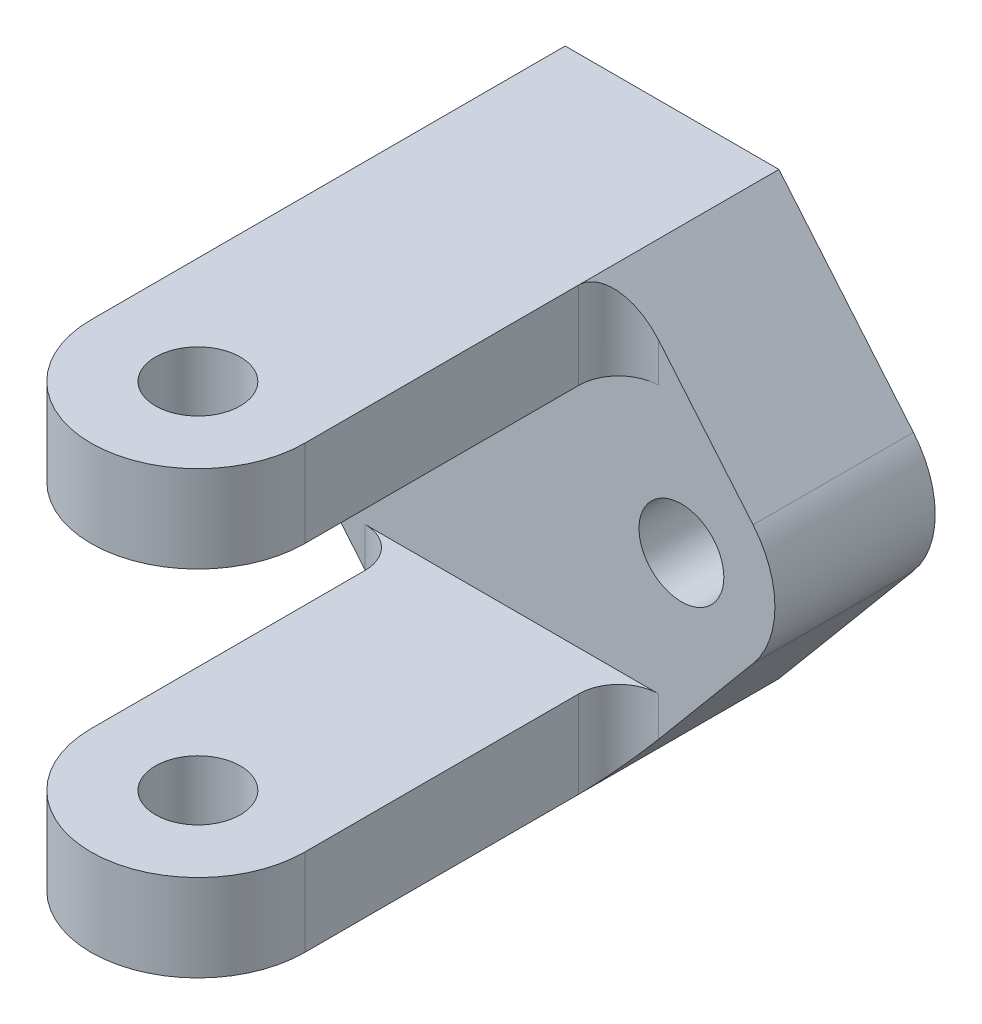
ISO-10303-21;
HEADER;
FILE_DESCRIPTION(('STEP AP214'),'2;1');
FILE_NAME('part.step','',(''),(''),'','','');
FILE_SCHEMA(('AUTOMOTIVE_DESIGN { 1 0 10303 214 1 1 1 1 }'));
ENDSEC;
DATA;
#1=APPLICATION_CONTEXT('core data for automotive mechanical design processes');
#2=APPLICATION_PROTOCOL_DEFINITION('international standard','automotive_design',2000,#1);
#3=PRODUCT_CONTEXT('',#1,'mechanical');
#4=PRODUCT('Part','Part','',(#3));
#5=PRODUCT_RELATED_PRODUCT_CATEGORY('part','',(#4));
#6=PRODUCT_DEFINITION_FORMATION('','',#4);
#7=PRODUCT_DEFINITION_CONTEXT('part definition',#1,'design');
#8=PRODUCT_DEFINITION('design','',#6,#7);
#9=PRODUCT_DEFINITION_SHAPE('','',#8);
#10=(LENGTH_UNIT() NAMED_UNIT(*) SI_UNIT(.MILLI.,.METRE.));
#11=(NAMED_UNIT(*) PLANE_ANGLE_UNIT() SI_UNIT($,.RADIAN.));
#12=(NAMED_UNIT(*) SI_UNIT($,.STERADIAN.) SOLID_ANGLE_UNIT());
#13=UNCERTAINTY_MEASURE_WITH_UNIT(LENGTH_MEASURE(1.E-05),#10,'distance_accuracy_value','');
#14=(GEOMETRIC_REPRESENTATION_CONTEXT(3) GLOBAL_UNCERTAINTY_ASSIGNED_CONTEXT((#13)) GLOBAL_UNIT_ASSIGNED_CONTEXT((#10,
#11,#12)) REPRESENTATION_CONTEXT('',''));
#15=CARTESIAN_POINT('',(0.,0.,0.));
#16=DIRECTION('',(0.,0.,1.));
#17=DIRECTION('',(1.,0.,0.));
#18=AXIS2_PLACEMENT_3D('',#15,#16,#17);
#19=CARTESIAN_POINT('',(-8.,-83.7629553253982,20.));
#20=DIRECTION('',(1.,0.,0.));
#21=DIRECTION('',(0.,0.,-1.));
#22=AXIS2_PLACEMENT_3D('',#19,#20,#21);
#23=PLANE('',#22);
#24=DIRECTION('',(0.,0.,1.));
#25=VECTOR('',#24,1.);
#26=CARTESIAN_POINT('',(-8.,16.51,20.));
#27=LINE('',#26,#25);
#28=CARTESIAN_POINT('',(-8.,16.51,15.));
#29=VERTEX_POINT('',#28);
#30=CARTESIAN_POINT('',(-8.,16.51,35.5));
#31=VERTEX_POINT('',#30);
#32=EDGE_CURVE('E194',#29,#31,#27,.T.);
#33=ORIENTED_EDGE('',*,*,#32,.F.);
#34=DIRECTION('',(0.,1.,0.));
#35=VECTOR('',#34,1.);
#36=CARTESIAN_POINT('',(-8.,9.99999999999999,15.));
#37=LINE('',#36,#35);
#38=CARTESIAN_POINT('',(-8.,10.,15.));
#39=VERTEX_POINT('',#38);
#40=EDGE_CURVE('E324',#29,#39,#37,.F.);
#41=ORIENTED_EDGE('',*,*,#40,.T.);
#42=DIRECTION('',(0.,0.,-1.));
#43=VECTOR('',#42,1.);
#44=CARTESIAN_POINT('',(-8.,10.,65.));
#45=LINE('',#44,#43);
#46=CARTESIAN_POINT('',(-8.,9.99999999999999,35.5));
#47=VERTEX_POINT('',#46);
#48=EDGE_CURVE('E250',#47,#39,#45,.T.);
#49=ORIENTED_EDGE('',*,*,#48,.F.);
#50=DIRECTION('',(0.,1.,0.));
#51=VECTOR('',#50,1.);
#52=CARTESIAN_POINT('',(-8.,-83.7629553253982,35.5));
#53=LINE('',#52,#51);
#54=EDGE_CURVE('E239',#47,#31,#53,.T.);
#55=ORIENTED_EDGE('',*,*,#54,.T.);
#56=EDGE_LOOP('',(#33,#41,#49,#55));
#57=FACE_BOUND('',#56,.T.);
#58=ADVANCED_FACE('F45',(#57),#23,.F.);
#59=CARTESIAN_POINT('',(8.,-83.7629553253982,35.5));
#60=DIRECTION('',(-1.,0.,0.));
#61=DIRECTION('',(0.,0.,1.));
#62=AXIS2_PLACEMENT_3D('',#59,#60,#61);
#63=PLANE('',#62);
#64=DIRECTION('',(0.,0.,1.));
#65=VECTOR('',#64,1.);
#66=CARTESIAN_POINT('',(8.,10.,65.));
#67=LINE('',#66,#65);
#68=CARTESIAN_POINT('',(8.,10.,15.));
#69=VERTEX_POINT('',#68);
#70=CARTESIAN_POINT('',(8.,9.99999999999999,35.5));
#71=VERTEX_POINT('',#70);
#72=EDGE_CURVE('E235',#69,#71,#67,.T.);
#73=ORIENTED_EDGE('',*,*,#72,.F.);
#74=DIRECTION('',(0.,1.,0.));
#75=VECTOR('',#74,1.);
#76=CARTESIAN_POINT('',(8.,16.51,15.));
#77=LINE('',#76,#75);
#78=CARTESIAN_POINT('',(8.,16.51,15.));
#79=VERTEX_POINT('',#78);
#80=EDGE_CURVE('E334',#69,#79,#77,.T.);
#81=ORIENTED_EDGE('',*,*,#80,.T.);
#82=DIRECTION('',(0.,0.,-1.));
#83=VECTOR('',#82,1.);
#84=CARTESIAN_POINT('',(8.,16.51,35.5));
#85=LINE('',#84,#83);
#86=CARTESIAN_POINT('',(8.,16.51,35.5));
#87=VERTEX_POINT('',#86);
#88=EDGE_CURVE('E219',#87,#79,#85,.T.);
#89=ORIENTED_EDGE('',*,*,#88,.F.);
#90=DIRECTION('',(0.,1.,0.));
#91=VECTOR('',#90,1.);
#92=CARTESIAN_POINT('',(8.,-83.7629553253982,35.5));
#93=LINE('',#92,#91);
#94=EDGE_CURVE('E223',#71,#87,#93,.T.);
#95=ORIENTED_EDGE('',*,*,#94,.F.);
#96=EDGE_LOOP('',(#73,#81,#89,#95));
#97=FACE_BOUND('',#96,.T.);
#98=ADVANCED_FACE('F384',(#97),#63,.F.);
#99=CARTESIAN_POINT('',(12.7,0.,47.3781062240477));
#100=DIRECTION('',(0.,0.,-1.));
#101=DIRECTION('',(-1.,0.,0.));
#102=AXIS2_PLACEMENT_3D('',#99,#100,#101);
#103=CYLINDRICAL_SURFACE('',#102,7.);
#104=CARTESIAN_POINT('',(12.7,0.,0.));
#105=DIRECTION('',(0.,0.,1.));
#106=DIRECTION('',(1.,0.,0.));
#107=AXIS2_PLACEMENT_3D('',#104,#105,#106);
#108=CIRCLE('',#107,7.);
#109=CARTESIAN_POINT('',(18.0657591468047,4.49540084736414,0.));
#110=VERTEX_POINT('',#109);
#111=CARTESIAN_POINT('',(18.0657591468047,-4.49540084736414,0.));
#112=VERTEX_POINT('',#111);
#113=EDGE_CURVE('E210',#110,#112,#108,.F.);
#114=ORIENTED_EDGE('',*,*,#113,.F.);
#115=DIRECTION('',(0.,0.,-1.));
#116=VECTOR('',#115,1.);
#117=CARTESIAN_POINT('',(18.0657591468047,4.49540084736414,27.6738667851937));
#118=LINE('',#117,#116);
#119=CARTESIAN_POINT('',(18.0657591468047,4.49540084736414,12.));
#120=VERTEX_POINT('',#119);
#121=EDGE_CURVE('E376',#120,#110,#118,.T.);
#122=ORIENTED_EDGE('',*,*,#121,.F.);
#123=CARTESIAN_POINT('',(12.7,0.,12.));
#124=DIRECTION('',(0.,0.,-1.));
#125=DIRECTION('',(-1.,0.,0.));
#126=AXIS2_PLACEMENT_3D('',#123,#124,#125);
#127=CIRCLE('',#126,7.);
#128=CARTESIAN_POINT('',(18.0657591468046,-4.49540084736413,12.));
#129=VERTEX_POINT('',#128);
#130=EDGE_CURVE('E201',#129,#120,#127,.F.);
#131=ORIENTED_EDGE('',*,*,#130,.F.);
#132=DIRECTION('',(0.,0.,-1.));
#133=VECTOR('',#132,1.);
#134=CARTESIAN_POINT('',(18.0657591468047,-4.49540084736414,27.6738667851937));
#135=LINE('',#134,#133);
#136=EDGE_CURVE('E204',#129,#112,#135,.T.);
#137=ORIENTED_EDGE('',*,*,#136,.T.);
#138=EDGE_LOOP('',(#114,#122,#131,#137));
#139=FACE_BOUND('',#138,.T.);
#140=ADVANCED_FACE('F446',(#139),#103,.T.);
#141=DIRECTION('',(0.,0.,1.));
#142=VECTOR('',#141,1.);
#143=CARTESIAN_POINT('',(-8.,-10.,65.));
#144=LINE('',#143,#142);
#145=CARTESIAN_POINT('',(-8.,-10.,15.));
#146=VERTEX_POINT('',#145);
#147=CARTESIAN_POINT('',(-8.,-9.99999999999999,35.5));
#148=VERTEX_POINT('',#147);
#149=EDGE_CURVE('E307',#146,#148,#144,.T.);
#150=ORIENTED_EDGE('',*,*,#149,.F.);
#151=DIRECTION('',(0.,-1.,0.));
#152=VECTOR('',#151,1.);
#153=CARTESIAN_POINT('',(-8.,-16.51,15.));
#154=LINE('',#153,#152);
#155=CARTESIAN_POINT('',(-8.,-16.51,15.));
#156=VERTEX_POINT('',#155);
#157=EDGE_CURVE('E327',#146,#156,#154,.T.);
#158=ORIENTED_EDGE('',*,*,#157,.T.);
#159=DIRECTION('',(0.,0.,1.));
#160=VECTOR('',#159,1.);
#161=CARTESIAN_POINT('',(-8.,-16.51,20.));
#162=LINE('',#161,#160);
#163=CARTESIAN_POINT('',(-8.,-16.51,35.5));
#164=VERTEX_POINT('',#163);
#165=EDGE_CURVE('E231',#156,#164,#162,.T.);
#166=ORIENTED_EDGE('',*,*,#165,.T.);
#167=EDGE_CURVE('E228',#164,#148,#53,.T.);
#168=ORIENTED_EDGE('',*,*,#167,.T.);
#169=EDGE_LOOP('',(#150,#158,#166,#168));
#170=FACE_BOUND('',#169,.T.);
#171=ADVANCED_FACE('F396',(#170),#23,.F.);
#172=CARTESIAN_POINT('',(-12.7,0.,47.3781062240477));
#173=DIRECTION('',(0.,0.,-1.));
#174=DIRECTION('',(-1.,0.,0.));
#175=AXIS2_PLACEMENT_3D('',#172,#173,#174);
#176=CYLINDRICAL_SURFACE('',#175,7.);
#177=CARTESIAN_POINT('',(-12.7,0.,12.));
#178=DIRECTION('',(0.,0.,-1.));
#179=DIRECTION('',(-1.,0.,0.));
#180=AXIS2_PLACEMENT_3D('',#177,#178,#179);
#181=CIRCLE('',#180,7.);
#182=CARTESIAN_POINT('',(-18.0657591468047,-4.49540084736414,12.));
#183=VERTEX_POINT('',#182);
#184=CARTESIAN_POINT('',(-18.0657591468047,4.49540084736414,12.));
#185=VERTEX_POINT('',#184);
#186=EDGE_CURVE('E173',#183,#185,#181,.T.);
#187=ORIENTED_EDGE('',*,*,#186,.T.);
#188=DIRECTION('',(0.,0.,-1.));
#189=VECTOR('',#188,1.);
#190=CARTESIAN_POINT('',(-18.0657591468047,4.49540084736414,27.6738667851937));
#191=LINE('',#190,#189);
#192=CARTESIAN_POINT('',(-18.0657591468047,4.49540084736414,0.));
#193=VERTEX_POINT('',#192);
#194=EDGE_CURVE('E180',#185,#193,#191,.T.);
#195=ORIENTED_EDGE('',*,*,#194,.T.);
#196=CARTESIAN_POINT('',(-12.7,0.,0.));
#197=DIRECTION('',(0.,0.,1.));
#198=DIRECTION('',(1.,0.,0.));
#199=AXIS2_PLACEMENT_3D('',#196,#197,#198);
#200=CIRCLE('',#199,7.);
#201=CARTESIAN_POINT('',(-18.0657591468046,-4.49540084736414,0.));
#202=VERTEX_POINT('',#201);
#203=EDGE_CURVE('E195',#193,#202,#200,.T.);
#204=ORIENTED_EDGE('',*,*,#203,.T.);
#205=DIRECTION('',(0.,0.,-1.));
#206=VECTOR('',#205,1.);
#207=CARTESIAN_POINT('',(-18.0657591468046,-4.49540084736414,27.6738667851937));
#208=LINE('',#207,#206);
#209=EDGE_CURVE('E192',#183,#202,#208,.T.);
#210=ORIENTED_EDGE('',*,*,#209,.F.);
#211=EDGE_LOOP('',(#187,#195,#204,#210));
#212=FACE_BOUND('',#211,.T.);
#213=ADVANCED_FACE('F190',(#212),#176,.T.);
#214=DIRECTION('',(0.,0.,-1.));
#215=VECTOR('',#214,1.);
#216=CARTESIAN_POINT('',(8.,-16.51,35.5));
#217=LINE('',#216,#215);
#218=CARTESIAN_POINT('',(8.,-16.51,35.5));
#219=VERTEX_POINT('',#218);
#220=CARTESIAN_POINT('',(8.,-16.51,15.));
#221=VERTEX_POINT('',#220);
#222=EDGE_CURVE('E224',#219,#221,#217,.T.);
#223=ORIENTED_EDGE('',*,*,#222,.T.);
#224=DIRECTION('',(0.,-1.,0.));
#225=VECTOR('',#224,1.);
#226=CARTESIAN_POINT('',(8.,-9.99999999999999,15.));
#227=LINE('',#226,#225);
#228=CARTESIAN_POINT('',(8.,-9.99999999999999,15.));
#229=VERTEX_POINT('',#228);
#230=EDGE_CURVE('E331',#221,#229,#227,.F.);
#231=ORIENTED_EDGE('',*,*,#230,.T.);
#232=DIRECTION('',(0.,0.,-1.));
#233=VECTOR('',#232,1.);
#234=CARTESIAN_POINT('',(8.,-9.99999999999999,65.));
#235=LINE('',#234,#233);
#236=CARTESIAN_POINT('',(8.,-9.99999999999999,35.5));
#237=VERTEX_POINT('',#236);
#238=EDGE_CURVE('E296',#237,#229,#235,.T.);
#239=ORIENTED_EDGE('',*,*,#238,.F.);
#240=EDGE_CURVE('E240',#219,#237,#93,.T.);
#241=ORIENTED_EDGE('',*,*,#240,.F.);
#242=EDGE_LOOP('',(#223,#231,#239,#241));
#243=FACE_BOUND('',#242,.T.);
#244=ADVANCED_FACE('F405',(#243),#63,.F.);
#245=CARTESIAN_POINT('',(0.,0.,12.));
#246=DIRECTION('',(0.,0.,-1.));
#247=DIRECTION('',(-1.,0.,0.));
#248=AXIS2_PLACEMENT_3D('',#245,#246,#247);
#249=PLANE('',#248);
#250=DIRECTION('',(1.,0.,0.));
#251=VECTOR('',#250,1.);
#252=CARTESIAN_POINT('',(-20.7,10.,12.));
#253=LINE('',#252,#251);
#254=CARTESIAN_POINT('',(-11.,10.,12.));
#255=VERTEX_POINT('',#254);
#256=CARTESIAN_POINT('',(11.,10.,12.));
#257=VERTEX_POINT('',#256);
#258=EDGE_CURVE('E270',#255,#257,#253,.T.);
#259=ORIENTED_EDGE('',*,*,#258,.F.);
#260=DIRECTION('',(0.,1.,0.));
#261=VECTOR('',#260,1.);
#262=CARTESIAN_POINT('',(-11.,16.51,12.));
#263=LINE('',#262,#261);
#264=CARTESIAN_POINT('',(-11.,12.9291675031933,12.));
#265=VERTEX_POINT('',#264);
#266=EDGE_CURVE('E176',#255,#265,#263,.T.);
#267=ORIENTED_EDGE('',*,*,#266,.T.);
#268=DIRECTION('',(0.64220012105202,0.766537020972093,0.));
#269=VECTOR('',#268,1.);
#270=CARTESIAN_POINT('',(-8.,16.51,12.));
#271=LINE('',#270,#269);
#272=EDGE_CURVE('E167',#185,#265,#271,.T.);
#273=ORIENTED_EDGE('',*,*,#272,.F.);
#274=ORIENTED_EDGE('',*,*,#186,.F.);
#275=DIRECTION('',(0.64220012105202,-0.766537020972093,0.));
#276=VECTOR('',#275,1.);
#277=CARTESIAN_POINT('',(-12.8280125042184,-10.7472319766351,12.));
#278=LINE('',#277,#276);
#279=CARTESIAN_POINT('',(-11.,-12.9291675031933,12.));
#280=VERTEX_POINT('',#279);
#281=EDGE_CURVE('E425',#183,#280,#278,.T.);
#282=ORIENTED_EDGE('',*,*,#281,.T.);
#283=DIRECTION('',(0.,-1.,0.));
#284=VECTOR('',#283,1.);
#285=CARTESIAN_POINT('',(-11.,-9.99999999999999,12.));
#286=LINE('',#285,#284);
#287=CARTESIAN_POINT('',(-11.,-10.,12.));
#288=VERTEX_POINT('',#287);
#289=EDGE_CURVE('E318',#280,#288,#286,.F.);
#290=ORIENTED_EDGE('',*,*,#289,.T.);
#291=DIRECTION('',(-1.,0.,0.));
#292=VECTOR('',#291,1.);
#293=CARTESIAN_POINT('',(-20.7,-10.,12.));
#294=LINE('',#293,#292);
#295=CARTESIAN_POINT('',(11.,-9.99999999999999,12.));
#296=VERTEX_POINT('',#295);
#297=EDGE_CURVE('E267',#296,#288,#294,.T.);
#298=ORIENTED_EDGE('',*,*,#297,.F.);
#299=DIRECTION('',(0.,-1.,0.));
#300=VECTOR('',#299,1.);
#301=CARTESIAN_POINT('',(11.,-16.51,12.));
#302=LINE('',#301,#300);
#303=CARTESIAN_POINT('',(11.,-12.9291675031933,12.));
#304=VERTEX_POINT('',#303);
#305=EDGE_CURVE('E314',#296,#304,#302,.T.);
#306=ORIENTED_EDGE('',*,*,#305,.T.);
#307=DIRECTION('',(-0.64220012105202,-0.766537020972093,0.));
#308=VECTOR('',#307,1.);
#309=CARTESIAN_POINT('',(12.8280125042185,-10.7472319766351,12.));
#310=LINE('',#309,#308);
#311=EDGE_CURVE('E212',#129,#304,#310,.T.);
#312=ORIENTED_EDGE('',*,*,#311,.F.);
#313=ORIENTED_EDGE('',*,*,#130,.T.);
#314=DIRECTION('',(-0.64220012105202,0.766537020972093,0.));
#315=VECTOR('',#314,1.);
#316=CARTESIAN_POINT('',(8.,16.51,12.));
#317=LINE('',#316,#315);
#318=CARTESIAN_POINT('',(11.,12.9291675031933,12.));
#319=VERTEX_POINT('',#318);
#320=EDGE_CURVE('E366',#120,#319,#317,.T.);
#321=ORIENTED_EDGE('',*,*,#320,.T.);
#322=DIRECTION('',(0.,1.,0.));
#323=VECTOR('',#322,1.);
#324=CARTESIAN_POINT('',(11.,9.99999999999999,12.));
#325=LINE('',#324,#323);
#326=EDGE_CURVE('E310',#319,#257,#325,.F.);
#327=ORIENTED_EDGE('',*,*,#326,.T.);
#328=EDGE_LOOP('',(#259,#267,#273,#274,#282,#290,#298,#306,#312,#313,#321,#327));
#329=FACE_BOUND('',#328,.T.);
#330=CARTESIAN_POINT('',(-12.7,0.,12.));
#331=DIRECTION('',(0.,0.,1.));
#332=DIRECTION('',(1.,0.,0.));
#333=AXIS2_PLACEMENT_3D('',#330,#331,#332);
#334=CIRCLE('',#333,3.175);
#335=CARTESIAN_POINT('',(-9.525,0.,12.));
#336=VERTEX_POINT('',#335);
#337=EDGE_CURVE('E274',#336,#336,#334,.T.);
#338=ORIENTED_EDGE('',*,*,#337,.F.);
#339=EDGE_LOOP('',(#338));
#340=FACE_BOUND('',#339,.T.);
#341=CARTESIAN_POINT('',(12.7,0.,12.));
#342=DIRECTION('',(0.,0.,1.));
#343=DIRECTION('',(1.,0.,0.));
#344=AXIS2_PLACEMENT_3D('',#341,#342,#343);
#345=CIRCLE('',#344,3.175);
#346=CARTESIAN_POINT('',(15.875,0.,12.));
#347=VERTEX_POINT('',#346);
#348=EDGE_CURVE('E282',#347,#347,#345,.T.);
#349=ORIENTED_EDGE('',*,*,#348,.F.);
#350=EDGE_LOOP('',(#349));
#351=FACE_BOUND('',#350,.T.);
#352=ADVANCED_FACE('F169',(#329,#340,#351),#249,.F.);
#353=CARTESIAN_POINT('',(0.,0.,0.));
#354=DIRECTION('',(0.,0.,-1.));
#355=DIRECTION('',(-1.,0.,0.));
#356=AXIS2_PLACEMENT_3D('',#353,#354,#355);
#357=PLANE('',#356);
#358=ORIENTED_EDGE('',*,*,#203,.F.);
#359=DIRECTION('',(-0.64220012105202,-0.766537020972093,0.));
#360=VECTOR('',#359,1.);
#361=CARTESIAN_POINT('',(-8.,16.51,0.));
#362=LINE('',#361,#360);
#363=CARTESIAN_POINT('',(-8.,16.51,0.));
#364=VERTEX_POINT('',#363);
#365=EDGE_CURVE('E185',#364,#193,#362,.T.);
#366=ORIENTED_EDGE('',*,*,#365,.F.);
#367=DIRECTION('',(-1.,0.,0.));
#368=VECTOR('',#367,1.);
#369=CARTESIAN_POINT('',(-20.7,16.51,0.));
#370=LINE('',#369,#368);
#371=CARTESIAN_POINT('',(8.,16.51,0.));
#372=VERTEX_POINT('',#371);
#373=EDGE_CURVE('E286',#372,#364,#370,.T.);
#374=ORIENTED_EDGE('',*,*,#373,.F.);
#375=DIRECTION('',(0.64220012105202,-0.766537020972093,0.));
#376=VECTOR('',#375,1.);
#377=CARTESIAN_POINT('',(8.,16.51,0.));
#378=LINE('',#377,#376);
#379=EDGE_CURVE('E428',#372,#110,#378,.T.);
#380=ORIENTED_EDGE('',*,*,#379,.T.);
#381=ORIENTED_EDGE('',*,*,#113,.T.);
#382=DIRECTION('',(0.64220012105202,0.766537020972093,0.));
#383=VECTOR('',#382,1.);
#384=CARTESIAN_POINT('',(12.8280125042185,-10.7472319766351,0.));
#385=LINE('',#384,#383);
#386=CARTESIAN_POINT('',(8.,-16.51,0.));
#387=VERTEX_POINT('',#386);
#388=EDGE_CURVE('E440',#387,#112,#385,.T.);
#389=ORIENTED_EDGE('',*,*,#388,.F.);
#390=DIRECTION('',(1.,0.,0.));
#391=VECTOR('',#390,1.);
#392=CARTESIAN_POINT('',(-20.7,-16.51,0.));
#393=LINE('',#392,#391);
#394=CARTESIAN_POINT('',(-8.,-16.51,0.));
#395=VERTEX_POINT('',#394);
#396=EDGE_CURVE('E293',#395,#387,#393,.T.);
#397=ORIENTED_EDGE('',*,*,#396,.F.);
#398=DIRECTION('',(-0.64220012105202,0.766537020972093,0.));
#399=VECTOR('',#398,1.);
#400=CARTESIAN_POINT('',(-12.8280125042184,-10.7472319766351,0.));
#401=LINE('',#400,#399);
#402=EDGE_CURVE('E432',#395,#202,#401,.T.);
#403=ORIENTED_EDGE('',*,*,#402,.T.);
#404=EDGE_LOOP('',(#358,#366,#374,#380,#381,#389,#397,#403));
#405=FACE_BOUND('',#404,.T.);
#406=CARTESIAN_POINT('',(12.7,0.,0.));
#407=DIRECTION('',(0.,0.,1.));
#408=DIRECTION('',(1.,0.,0.));
#409=AXIS2_PLACEMENT_3D('',#406,#407,#408);
#410=CIRCLE('',#409,3.175);
#411=CARTESIAN_POINT('',(15.875,0.,0.));
#412=VERTEX_POINT('',#411);
#413=EDGE_CURVE('E278',#412,#412,#410,.T.);
#414=ORIENTED_EDGE('',*,*,#413,.T.);
#415=EDGE_LOOP('',(#414));
#416=FACE_BOUND('',#415,.T.);
#417=CARTESIAN_POINT('',(-12.7,0.,0.));
#418=DIRECTION('',(0.,0.,1.));
#419=DIRECTION('',(1.,0.,0.));
#420=AXIS2_PLACEMENT_3D('',#417,#418,#419);
#421=CIRCLE('',#420,3.175);
#422=CARTESIAN_POINT('',(-9.525,0.,0.));
#423=VERTEX_POINT('',#422);
#424=EDGE_CURVE('E273',#423,#423,#421,.T.);
#425=ORIENTED_EDGE('',*,*,#424,.T.);
#426=EDGE_LOOP('',(#425));
#427=FACE_BOUND('',#426,.T.);
#428=ADVANCED_FACE('F449',(#405,#416,#427),#357,.T.);
#429=CARTESIAN_POINT('',(-20.7,16.51,12.));
#430=DIRECTION('',(0.,-1.,0.));
#431=DIRECTION('',(0.,0.,-1.));
#432=AXIS2_PLACEMENT_3D('',#429,#430,#431);
#433=PLANE('',#432);
#434=CARTESIAN_POINT('',(0.,16.51,35.5));
#435=DIRECTION('',(0.,-1.,0.));
#436=DIRECTION('',(0.,0.,-1.));
#437=AXIS2_PLACEMENT_3D('',#434,#435,#436);
#438=CIRCLE('',#437,3.175);
#439=CARTESIAN_POINT('',(0.,16.51,38.675));
#440=VERTEX_POINT('',#439);
#441=EDGE_CURVE('E254',#440,#440,#438,.T.);
#442=ORIENTED_EDGE('',*,*,#441,.T.);
#443=EDGE_LOOP('',(#442));
#444=FACE_BOUND('',#443,.T.);
#445=ORIENTED_EDGE('',*,*,#373,.T.);
#446=EDGE_CURVE('E199',#364,#29,#27,.T.);
#447=ORIENTED_EDGE('',*,*,#446,.T.);
#448=ORIENTED_EDGE('',*,*,#32,.T.);
#449=CARTESIAN_POINT('',(0.,16.51,35.5));
#450=DIRECTION('',(0.,-1.,0.));
#451=DIRECTION('',(0.,0.,-1.));
#452=AXIS2_PLACEMENT_3D('',#449,#450,#451);
#453=CIRCLE('',#452,8.);
#454=EDGE_CURVE('E215',#31,#87,#453,.F.);
#455=ORIENTED_EDGE('',*,*,#454,.T.);
#456=ORIENTED_EDGE('',*,*,#88,.T.);
#457=DIRECTION('',(0.,0.,-1.));
#458=VECTOR('',#457,1.);
#459=CARTESIAN_POINT('',(8.,16.51,27.6738667851937));
#460=LINE('',#459,#458);
#461=EDGE_CURVE('E368',#79,#372,#460,.T.);
#462=ORIENTED_EDGE('',*,*,#461,.T.);
#463=EDGE_LOOP('',(#445,#447,#448,#455,#456,#462));
#464=FACE_BOUND('',#463,.T.);
#465=ADVANCED_FACE('F460',(#444,#464),#433,.F.);
#466=CARTESIAN_POINT('',(-20.7,-16.51,12.));
#467=DIRECTION('',(0.,1.,0.));
#468=DIRECTION('',(0.,0.,1.));
#469=AXIS2_PLACEMENT_3D('',#466,#467,#468);
#470=PLANE('',#469);
#471=CARTESIAN_POINT('',(0.,-16.51,35.5));
#472=DIRECTION('',(0.,1.,0.));
#473=DIRECTION('',(0.,0.,1.));
#474=AXIS2_PLACEMENT_3D('',#471,#472,#473);
#475=CIRCLE('',#474,3.175);
#476=CARTESIAN_POINT('',(0.,-16.51,38.675));
#477=VERTEX_POINT('',#476);
#478=EDGE_CURVE('E258',#477,#477,#475,.F.);
#479=ORIENTED_EDGE('',*,*,#478,.F.);
#480=EDGE_LOOP('',(#479));
#481=FACE_BOUND('',#480,.T.);
#482=EDGE_CURVE('E232',#395,#156,#162,.T.);
#483=ORIENTED_EDGE('',*,*,#482,.F.);
#484=ORIENTED_EDGE('',*,*,#396,.T.);
#485=DIRECTION('',(0.,0.,-1.));
#486=VECTOR('',#485,1.);
#487=CARTESIAN_POINT('',(8.,-16.51,27.6738667851937));
#488=LINE('',#487,#486);
#489=EDGE_CURVE('E62',#221,#387,#488,.T.);
#490=ORIENTED_EDGE('',*,*,#489,.F.);
#491=ORIENTED_EDGE('',*,*,#222,.F.);
#492=CARTESIAN_POINT('',(0.,-16.51,35.5));
#493=DIRECTION('',(0.,1.,0.));
#494=DIRECTION('',(0.,0.,1.));
#495=AXIS2_PLACEMENT_3D('',#492,#493,#494);
#496=CIRCLE('',#495,8.);
#497=EDGE_CURVE('E227',#164,#219,#496,.T.);
#498=ORIENTED_EDGE('',*,*,#497,.F.);
#499=ORIENTED_EDGE('',*,*,#165,.F.);
#500=EDGE_LOOP('',(#483,#484,#490,#491,#498,#499));
#501=FACE_BOUND('',#500,.T.);
#502=ADVANCED_FACE('F403',(#481,#501),#470,.F.);
#503=CARTESIAN_POINT('',(12.7,0.,12.));
#504=DIRECTION('',(0.,0.,-1.));
#505=DIRECTION('',(-1.,0.,0.));
#506=AXIS2_PLACEMENT_3D('',#503,#504,#505);
#507=CYLINDRICAL_SURFACE('',#506,3.175);
#508=ORIENTED_EDGE('',*,*,#348,.T.);
#509=EDGE_LOOP('',(#508));
#510=FACE_BOUND('',#509,.T.);
#511=ORIENTED_EDGE('',*,*,#413,.F.);
#512=EDGE_LOOP('',(#511));
#513=FACE_BOUND('',#512,.T.);
#514=ADVANCED_FACE('F594',(#510,#513),#507,.F.);
#515=CARTESIAN_POINT('',(-12.7,0.,12.));
#516=DIRECTION('',(0.,0.,-1.));
#517=DIRECTION('',(-1.,0.,0.));
#518=AXIS2_PLACEMENT_3D('',#515,#516,#517);
#519=CYLINDRICAL_SURFACE('',#518,3.175);
#520=ORIENTED_EDGE('',*,*,#337,.T.);
#521=EDGE_LOOP('',(#520));
#522=FACE_BOUND('',#521,.T.);
#523=ORIENTED_EDGE('',*,*,#424,.F.);
#524=EDGE_LOOP('',(#523));
#525=FACE_BOUND('',#524,.T.);
#526=ADVANCED_FACE('F585',(#522,#525),#519,.F.);
#527=CARTESIAN_POINT('',(-20.7,10.,65.));
#528=DIRECTION('',(0.,1.,0.));
#529=DIRECTION('',(0.,0.,1.));
#530=AXIS2_PLACEMENT_3D('',#527,#528,#529);
#531=PLANE('',#530);
#532=CARTESIAN_POINT('',(0.,10.,35.5));
#533=DIRECTION('',(0.,1.,0.));
#534=DIRECTION('',(0.,0.,1.));
#535=AXIS2_PLACEMENT_3D('',#532,#533,#534);
#536=CIRCLE('',#535,3.175);
#537=CARTESIAN_POINT('',(0.,10.,38.675));
#538=VERTEX_POINT('',#537);
#539=EDGE_CURVE('E263',#538,#538,#536,.T.);
#540=ORIENTED_EDGE('',*,*,#539,.T.);
#541=EDGE_LOOP('',(#540));
#542=FACE_BOUND('',#541,.T.);
#543=CARTESIAN_POINT('',(0.,9.99999999999999,35.5));
#544=DIRECTION('',(0.,1.,0.));
#545=DIRECTION('',(0.,0.,1.));
#546=AXIS2_PLACEMENT_3D('',#543,#544,#545);
#547=CIRCLE('',#546,8.);
#548=EDGE_CURVE('E246',#71,#47,#547,.F.);
#549=ORIENTED_EDGE('',*,*,#548,.T.);
#550=ORIENTED_EDGE('',*,*,#48,.T.);
#551=CARTESIAN_POINT('',(-11.,10.,15.));
#552=DIRECTION('',(0.,1.,0.));
#553=DIRECTION('',(0.,0.,1.));
#554=AXIS2_PLACEMENT_3D('',#551,#552,#553);
#555=CIRCLE('',#554,3.);
#556=EDGE_CURVE('E341',#39,#255,#555,.T.);
#557=ORIENTED_EDGE('',*,*,#556,.T.);
#558=ORIENTED_EDGE('',*,*,#258,.T.);
#559=CARTESIAN_POINT('',(11.,9.99999999999999,15.));
#560=DIRECTION('',(0.,1.,0.));
#561=DIRECTION('',(0.,0.,1.));
#562=AXIS2_PLACEMENT_3D('',#559,#560,#561);
#563=CIRCLE('',#562,3.);
#564=EDGE_CURVE('E11',#257,#69,#563,.T.);
#565=ORIENTED_EDGE('',*,*,#564,.T.);
#566=ORIENTED_EDGE('',*,*,#72,.T.);
#567=EDGE_LOOP('',(#549,#550,#557,#558,#565,#566));
#568=FACE_BOUND('',#567,.T.);
#569=ADVANCED_FACE('F380',(#542,#568),#531,.F.);
#570=CARTESIAN_POINT('',(-20.7,-10.,65.));
#571=DIRECTION('',(0.,-1.,0.));
#572=DIRECTION('',(1.,0.,0.));
#573=AXIS2_PLACEMENT_3D('',#570,#571,#572);
#574=PLANE('',#573);
#575=CARTESIAN_POINT('',(0.,-9.99999999999999,35.5));
#576=DIRECTION('',(0.,-1.,0.));
#577=DIRECTION('',(1.,0.,0.));
#578=AXIS2_PLACEMENT_3D('',#575,#576,#577);
#579=CIRCLE('',#578,3.175);
#580=CARTESIAN_POINT('',(0.,-9.99999999999999,38.675));
#581=VERTEX_POINT('',#580);
#582=EDGE_CURVE('E262',#581,#581,#579,.T.);
#583=ORIENTED_EDGE('',*,*,#582,.T.);
#584=EDGE_LOOP('',(#583));
#585=FACE_BOUND('',#584,.T.);
#586=ORIENTED_EDGE('',*,*,#297,.T.);
#587=CARTESIAN_POINT('',(-11.,-10.,15.));
#588=DIRECTION('',(0.,-1.,0.));
#589=DIRECTION('',(1.,0.,0.));
#590=AXIS2_PLACEMENT_3D('',#587,#588,#589);
#591=CIRCLE('',#590,3.);
#592=EDGE_CURVE('E348',#288,#146,#591,.T.);
#593=ORIENTED_EDGE('',*,*,#592,.T.);
#594=ORIENTED_EDGE('',*,*,#149,.T.);
#595=CARTESIAN_POINT('',(0.,-9.99999999999999,35.5));
#596=DIRECTION('',(0.,-1.,0.));
#597=DIRECTION('',(1.,0.,0.));
#598=AXIS2_PLACEMENT_3D('',#595,#596,#597);
#599=CIRCLE('',#598,8.);
#600=EDGE_CURVE('E303',#148,#237,#599,.F.);
#601=ORIENTED_EDGE('',*,*,#600,.T.);
#602=ORIENTED_EDGE('',*,*,#238,.T.);
#603=CARTESIAN_POINT('',(11.,-9.99999999999999,15.));
#604=DIRECTION('',(0.,-1.,0.));
#605=DIRECTION('',(1.,0.,0.));
#606=AXIS2_PLACEMENT_3D('',#603,#604,#605);
#607=CIRCLE('',#606,3.);
#608=EDGE_CURVE('E355',#229,#296,#607,.T.);
#609=ORIENTED_EDGE('',*,*,#608,.T.);
#610=EDGE_LOOP('',(#586,#593,#594,#601,#602,#609));
#611=FACE_BOUND('',#610,.T.);
#612=ADVANCED_FACE('F417',(#585,#611),#574,.F.);
#613=CARTESIAN_POINT('',(0.,-25.4902561210691,35.5));
#614=DIRECTION('',(0.,1.,0.));
#615=DIRECTION('',(0.,0.,1.));
#616=AXIS2_PLACEMENT_3D('',#613,#614,#615);
#617=CYLINDRICAL_SURFACE('',#616,3.175);
#618=CARTESIAN_POINT('',(0.,-16.51,38.675));
#619=CARTESIAN_POINT('',(0.,-16.4421875,38.675));
#620=CARTESIAN_POINT('',(0.,-16.374375,38.675));
#621=CARTESIAN_POINT('',(0.,-16.23875,38.675));
#622=CARTESIAN_POINT('',(0.,-16.1709375,38.675));
#623=CARTESIAN_POINT('',(0.,-16.0353125,38.675));
#624=CARTESIAN_POINT('',(0.,-15.9675,38.675));
#625=CARTESIAN_POINT('',(0.,-15.831875,38.675));
#626=CARTESIAN_POINT('',(0.,-15.7640625,38.675));
#627=CARTESIAN_POINT('',(0.,-15.6284375,38.675));
#628=CARTESIAN_POINT('',(0.,-15.560625,38.675));
#629=CARTESIAN_POINT('',(0.,-15.425,38.675));
#630=CARTESIAN_POINT('',(0.,-15.3571875,38.675));
#631=CARTESIAN_POINT('',(0.,-15.2215625,38.675));
#632=CARTESIAN_POINT('',(0.,-15.15375,38.675));
#633=CARTESIAN_POINT('',(0.,-15.018125,38.675));
#634=CARTESIAN_POINT('',(0.,-14.9503125,38.675));
#635=CARTESIAN_POINT('',(0.,-14.8146875,38.675));
#636=CARTESIAN_POINT('',(0.,-14.746875,38.675));
#637=CARTESIAN_POINT('',(0.,-14.61125,38.675));
#638=CARTESIAN_POINT('',(0.,-14.5434375,38.675));
#639=CARTESIAN_POINT('',(0.,-14.4078125,38.675));
#640=CARTESIAN_POINT('',(0.,-14.34,38.675));
#641=CARTESIAN_POINT('',(0.,-14.204375,38.675));
#642=CARTESIAN_POINT('',(0.,-14.1365625,38.675));
#643=CARTESIAN_POINT('',(0.,-14.0009375,38.675));
#644=CARTESIAN_POINT('',(0.,-13.933125,38.675));
#645=CARTESIAN_POINT('',(0.,-13.7975,38.675));
#646=CARTESIAN_POINT('',(0.,-13.7296875,38.675));
#647=CARTESIAN_POINT('',(0.,-13.5940625,38.675));
#648=CARTESIAN_POINT('',(0.,-13.52625,38.675));
#649=CARTESIAN_POINT('',(0.,-13.390625,38.675));
#650=CARTESIAN_POINT('',(0.,-13.3228125,38.675));
#651=CARTESIAN_POINT('',(0.,-13.1871875,38.675));
#652=CARTESIAN_POINT('',(0.,-13.119375,38.675));
#653=CARTESIAN_POINT('',(0.,-12.98375,38.675));
#654=CARTESIAN_POINT('',(0.,-12.9159375,38.675));
#655=CARTESIAN_POINT('',(0.,-12.7803125,38.675));
#656=CARTESIAN_POINT('',(0.,-12.7125,38.675));
#657=CARTESIAN_POINT('',(0.,-12.576875,38.675));
#658=CARTESIAN_POINT('',(0.,-12.5090625,38.675));
#659=CARTESIAN_POINT('',(0.,-12.3734375,38.675));
#660=CARTESIAN_POINT('',(0.,-12.305625,38.675));
#661=CARTESIAN_POINT('',(0.,-12.17,38.675));
#662=CARTESIAN_POINT('',(0.,-12.1021875,38.675));
#663=CARTESIAN_POINT('',(0.,-11.9665625,38.675));
#664=CARTESIAN_POINT('',(0.,-11.89875,38.675));
#665=CARTESIAN_POINT('',(0.,-11.763125,38.675));
#666=CARTESIAN_POINT('',(0.,-11.6953125,38.675));
#667=CARTESIAN_POINT('',(0.,-11.5596875,38.675));
#668=CARTESIAN_POINT('',(0.,-11.491875,38.675));
#669=CARTESIAN_POINT('',(0.,-11.35625,38.675));
#670=CARTESIAN_POINT('',(0.,-11.2884375,38.675));
#671=CARTESIAN_POINT('',(0.,-11.1528125,38.675));
#672=CARTESIAN_POINT('',(0.,-11.085,38.675));
#673=CARTESIAN_POINT('',(0.,-10.949375,38.675));
#674=CARTESIAN_POINT('',(0.,-10.8815625,38.675));
#675=CARTESIAN_POINT('',(0.,-10.7459375,38.675));
#676=CARTESIAN_POINT('',(0.,-10.678125,38.675));
#677=CARTESIAN_POINT('',(0.,-10.5425,38.675));
#678=CARTESIAN_POINT('',(0.,-10.4746875,38.675));
#679=CARTESIAN_POINT('',(0.,-10.3390625,38.675));
#680=CARTESIAN_POINT('',(0.,-10.27125,38.675));
#681=CARTESIAN_POINT('',(0.,-10.135625,38.675));
#682=CARTESIAN_POINT('',(0.,-10.0678125,38.675));
#683=CARTESIAN_POINT('',(0.,-9.99999999999999,38.675));
#684=B_SPLINE_CURVE_WITH_KNOTS('',3,(#618,#619,#620,#621,#622,#623,#624,#625,#626,#627,#628,
#629,#630,#631,#632,#633,#634,#635,#636,#637,#638,#639,#640,#641,#642,#643,#644,#645,#646,#647,
#648,#649,#650,#651,#652,#653,#654,#655,#656,#657,#658,#659,#660,#661,#662,#663,#664,#665,#666,
#667,#668,#669,#670,#671,#672,#673,#674,#675,#676,#677,#678,#679,#680,#681,#682,#683),
.UNSPECIFIED.,.F.,.F.,(4,2,2,2,2,2,2,2,2,2,2,2,2,2,2,2,2,2,2,2,2,2,2,2,2,2,2,2,2,2,2,2,4),(0.,
0.2034375,0.406875000000001,0.610312500000001,0.813750000000002,1.0171875,1.220625,1.4240625,
1.6275,1.8309375,2.03437500000001,2.2378125,2.44125,2.6446875,2.84812500000001,3.05156250000001,
3.25500000000001,3.45843750000001,3.66187500000001,3.86531250000001,4.06875000000001,
4.27218750000001,4.47562500000001,4.67906250000001,4.88250000000001,5.08593750000001,
5.28937500000001,5.49281250000001,5.69625000000001,5.89968750000001,6.10312500000001,
6.30656250000001,6.51000000000001),.UNSPECIFIED.);
#685=EDGE_CURVE('BSEAM561',#477,#581,#684,.T.);
#686=ORIENTED_EDGE('',*,*,#478,.T.);
#687=ORIENTED_EDGE('',*,*,#582,.F.);
#688=ORIENTED_EDGE('',*,*,#685,.T.);
#689=ORIENTED_EDGE('',*,*,#685,.F.);
#690=EDGE_LOOP('',(#686,#688,#687,#689));
#691=FACE_BOUND('',#690,.T.);
#692=ADVANCED_FACE('F561',(#691),#617,.F.);
#693=CARTESIAN_POINT('',(0.,16.51,38.675));
#694=CARTESIAN_POINT('',(0.,16.4421875,38.675));
#695=CARTESIAN_POINT('',(0.,16.374375,38.675));
#696=CARTESIAN_POINT('',(0.,16.23875,38.675));
#697=CARTESIAN_POINT('',(0.,16.1709375,38.675));
#698=CARTESIAN_POINT('',(0.,16.0353125,38.675));
#699=CARTESIAN_POINT('',(0.,15.9675,38.675));
#700=CARTESIAN_POINT('',(0.,15.831875,38.675));
#701=CARTESIAN_POINT('',(0.,15.7640625,38.675));
#702=CARTESIAN_POINT('',(0.,15.6284375,38.675));
#703=CARTESIAN_POINT('',(0.,15.560625,38.675));
#704=CARTESIAN_POINT('',(0.,15.425,38.675));
#705=CARTESIAN_POINT('',(0.,15.3571875,38.675));
#706=CARTESIAN_POINT('',(0.,15.2215625,38.675));
#707=CARTESIAN_POINT('',(0.,15.15375,38.675));
#708=CARTESIAN_POINT('',(0.,15.018125,38.675));
#709=CARTESIAN_POINT('',(0.,14.9503125,38.675));
#710=CARTESIAN_POINT('',(0.,14.8146875,38.675));
#711=CARTESIAN_POINT('',(0.,14.746875,38.675));
#712=CARTESIAN_POINT('',(0.,14.61125,38.675));
#713=CARTESIAN_POINT('',(0.,14.5434375,38.675));
#714=CARTESIAN_POINT('',(0.,14.4078125,38.675));
#715=CARTESIAN_POINT('',(0.,14.34,38.675));
#716=CARTESIAN_POINT('',(0.,14.204375,38.675));
#717=CARTESIAN_POINT('',(0.,14.1365625,38.675));
#718=CARTESIAN_POINT('',(0.,14.0009375,38.675));
#719=CARTESIAN_POINT('',(0.,13.933125,38.675));
#720=CARTESIAN_POINT('',(0.,13.7975,38.675));
#721=CARTESIAN_POINT('',(0.,13.7296875,38.675));
#722=CARTESIAN_POINT('',(0.,13.5940625,38.675));
#723=CARTESIAN_POINT('',(0.,13.52625,38.675));
#724=CARTESIAN_POINT('',(0.,13.390625,38.675));
#725=CARTESIAN_POINT('',(0.,13.3228125,38.675));
#726=CARTESIAN_POINT('',(0.,13.1871875,38.675));
#727=CARTESIAN_POINT('',(0.,13.119375,38.675));
#728=CARTESIAN_POINT('',(0.,12.98375,38.675));
#729=CARTESIAN_POINT('',(0.,12.9159375,38.675));
#730=CARTESIAN_POINT('',(0.,12.7803125,38.675));
#731=CARTESIAN_POINT('',(0.,12.7125,38.675));
#732=CARTESIAN_POINT('',(0.,12.576875,38.675));
#733=CARTESIAN_POINT('',(0.,12.5090625,38.675));
#734=CARTESIAN_POINT('',(0.,12.3734375,38.675));
#735=CARTESIAN_POINT('',(0.,12.305625,38.675));
#736=CARTESIAN_POINT('',(0.,12.17,38.675));
#737=CARTESIAN_POINT('',(0.,12.1021875,38.675));
#738=CARTESIAN_POINT('',(0.,11.9665625,38.675));
#739=CARTESIAN_POINT('',(0.,11.89875,38.675));
#740=CARTESIAN_POINT('',(0.,11.763125,38.675));
#741=CARTESIAN_POINT('',(0.,11.6953125,38.675));
#742=CARTESIAN_POINT('',(0.,11.5596875,38.675));
#743=CARTESIAN_POINT('',(0.,11.491875,38.675));
#744=CARTESIAN_POINT('',(0.,11.35625,38.675));
#745=CARTESIAN_POINT('',(0.,11.2884375,38.675));
#746=CARTESIAN_POINT('',(0.,11.1528125,38.675));
#747=CARTESIAN_POINT('',(0.,11.085,38.675));
#748=CARTESIAN_POINT('',(0.,10.949375,38.675));
#749=CARTESIAN_POINT('',(0.,10.8815625,38.675));
#750=CARTESIAN_POINT('',(0.,10.7459375,38.675));
#751=CARTESIAN_POINT('',(0.,10.678125,38.675));
#752=CARTESIAN_POINT('',(0.,10.5425,38.675));
#753=CARTESIAN_POINT('',(0.,10.4746875,38.675));
#754=CARTESIAN_POINT('',(0.,10.3390625,38.675));
#755=CARTESIAN_POINT('',(0.,10.27125,38.675));
#756=CARTESIAN_POINT('',(0.,10.135625,38.675));
#757=CARTESIAN_POINT('',(0.,10.0678125,38.675));
#758=CARTESIAN_POINT('',(0.,10.,38.675));
#759=B_SPLINE_CURVE_WITH_KNOTS('',3,(#693,#694,#695,#696,#697,#698,#699,#700,#701,#702,#703,
#704,#705,#706,#707,#708,#709,#710,#711,#712,#713,#714,#715,#716,#717,#718,#719,#720,#721,#722,
#723,#724,#725,#726,#727,#728,#729,#730,#731,#732,#733,#734,#735,#736,#737,#738,#739,#740,#741,
#742,#743,#744,#745,#746,#747,#748,#749,#750,#751,#752,#753,#754,#755,#756,#757,#758),
.UNSPECIFIED.,.F.,.F.,(4,2,2,2,2,2,2,2,2,2,2,2,2,2,2,2,2,2,2,2,2,2,2,2,2,2,2,2,2,2,2,2,4),(0.,
0.2034375,0.406875000000001,0.610312500000001,0.813750000000002,1.0171875,1.220625,1.4240625,
1.6275,1.8309375,2.034375,2.2378125,2.44125,2.6446875,2.848125,3.0515625,3.255,3.4584375,
3.661875,3.8653125,4.06875,4.2721875,4.475625,4.6790625,4.8825,5.0859375,5.289375,5.4928125,
5.69625,5.8996875,6.103125,6.3065625,6.51),.UNSPECIFIED.);
#760=EDGE_CURVE('BSEAM554',#440,#538,#759,.T.);
#761=ORIENTED_EDGE('',*,*,#441,.F.);
#762=ORIENTED_EDGE('',*,*,#539,.F.);
#763=ORIENTED_EDGE('',*,*,#760,.T.);
#764=ORIENTED_EDGE('',*,*,#760,.F.);
#765=EDGE_LOOP('',(#761,#763,#762,#764));
#766=FACE_BOUND('',#765,.T.);
#767=ADVANCED_FACE('F554',(#766),#617,.F.);
#768=CARTESIAN_POINT('',(0.,-83.7629553253982,35.5));
#769=DIRECTION('',(0.,1.,0.));
#770=DIRECTION('',(0.,0.,1.));
#771=AXIS2_PLACEMENT_3D('',#768,#769,#770);
#772=CYLINDRICAL_SURFACE('',#771,8.);
#773=ORIENTED_EDGE('',*,*,#167,.F.);
#774=ORIENTED_EDGE('',*,*,#497,.T.);
#775=ORIENTED_EDGE('',*,*,#240,.T.);
#776=ORIENTED_EDGE('',*,*,#600,.F.);
#777=EDGE_LOOP('',(#773,#774,#775,#776));
#778=FACE_BOUND('',#777,.T.);
#779=ADVANCED_FACE('F401',(#778),#772,.T.);
#780=ORIENTED_EDGE('',*,*,#94,.T.);
#781=ORIENTED_EDGE('',*,*,#454,.F.);
#782=ORIENTED_EDGE('',*,*,#54,.F.);
#783=ORIENTED_EDGE('',*,*,#548,.F.);
#784=EDGE_LOOP('',(#780,#781,#782,#783));
#785=FACE_BOUND('',#784,.T.);
#786=ADVANCED_FACE('F463',(#785),#772,.T.);
#787=CARTESIAN_POINT('',(12.8280125042185,-10.7472319766351,27.6738667851937));
#788=DIRECTION('',(-0.766537020972093,0.64220012105202,0.));
#789=DIRECTION('',(-0.64220012105202,-0.766537020972093,0.));
#790=AXIS2_PLACEMENT_3D('',#787,#788,#789);
#791=PLANE('',#790);
#792=ORIENTED_EDGE('',*,*,#136,.F.);
#793=ORIENTED_EDGE('',*,*,#311,.T.);
#794=CARTESIAN_POINT('',(11.,-12.9291675031933,15.));
#795=DIRECTION('',(-0.766537020972093,0.64220012105202,0.));
#796=DIRECTION('',(0.64220012105202,0.766537020972093,0.));
#797=AXIS2_PLACEMENT_3D('',#794,#795,#796);
#798=ELLIPSE('',#797,4.67144103785834,3.);
#799=EDGE_CURVE('E351',#304,#221,#798,.T.);
#800=ORIENTED_EDGE('',*,*,#799,.T.);
#801=ORIENTED_EDGE('',*,*,#489,.T.);
#802=ORIENTED_EDGE('',*,*,#388,.T.);
#803=EDGE_LOOP('',(#792,#793,#800,#801,#802));
#804=FACE_BOUND('',#803,.T.);
#805=ADVANCED_FACE('F409',(#804),#791,.F.);
#806=CARTESIAN_POINT('',(-12.8280125042184,-10.7472319766351,27.6738667851937));
#807=DIRECTION('',(-0.766537020972093,-0.64220012105202,0.));
#808=DIRECTION('',(0.64220012105202,-0.766537020972093,0.));
#809=AXIS2_PLACEMENT_3D('',#806,#807,#808);
#810=PLANE('',#809);
#811=ORIENTED_EDGE('',*,*,#281,.F.);
#812=ORIENTED_EDGE('',*,*,#209,.T.);
#813=ORIENTED_EDGE('',*,*,#402,.F.);
#814=ORIENTED_EDGE('',*,*,#482,.T.);
#815=CARTESIAN_POINT('',(-11.,-12.9291675031933,15.));
#816=DIRECTION('',(-0.766537020972093,-0.64220012105202,0.));
#817=DIRECTION('',(-0.64220012105202,0.766537020972093,0.));
#818=AXIS2_PLACEMENT_3D('',#815,#816,#817);
#819=ELLIPSE('',#818,4.67144103785834,3.);
#820=EDGE_CURVE('E345',#156,#280,#819,.F.);
#821=ORIENTED_EDGE('',*,*,#820,.T.);
#822=EDGE_LOOP('',(#811,#812,#813,#814,#821));
#823=FACE_BOUND('',#822,.T.);
#824=ADVANCED_FACE('F424',(#823),#810,.T.);
#825=CARTESIAN_POINT('',(8.,16.51,27.6738667851937));
#826=DIRECTION('',(0.766537020972093,0.64220012105202,0.));
#827=DIRECTION('',(-0.64220012105202,0.766537020972093,0.));
#828=AXIS2_PLACEMENT_3D('',#825,#826,#827);
#829=PLANE('',#828);
#830=ORIENTED_EDGE('',*,*,#320,.F.);
#831=ORIENTED_EDGE('',*,*,#121,.T.);
#832=ORIENTED_EDGE('',*,*,#379,.F.);
#833=ORIENTED_EDGE('',*,*,#461,.F.);
#834=CARTESIAN_POINT('',(11.,12.9291675031933,15.));
#835=DIRECTION('',(0.766537020972093,0.64220012105202,0.));
#836=DIRECTION('',(0.64220012105202,-0.766537020972093,0.));
#837=AXIS2_PLACEMENT_3D('',#834,#835,#836);
#838=ELLIPSE('',#837,4.67144103785834,3.);
#839=EDGE_CURVE('E55',#79,#319,#838,.F.);
#840=ORIENTED_EDGE('',*,*,#839,.T.);
#841=EDGE_LOOP('',(#830,#831,#832,#833,#840));
#842=FACE_BOUND('',#841,.T.);
#843=ADVANCED_FACE('F364',(#842),#829,.T.);
#844=CARTESIAN_POINT('',(-8.,16.51,27.6738667851937));
#845=DIRECTION('',(0.766537020972093,-0.64220012105202,0.));
#846=DIRECTION('',(0.64220012105202,0.766537020972093,0.));
#847=AXIS2_PLACEMENT_3D('',#844,#845,#846);
#848=PLANE('',#847);
#849=ORIENTED_EDGE('',*,*,#194,.F.);
#850=ORIENTED_EDGE('',*,*,#272,.T.);
#851=CARTESIAN_POINT('',(-11.,12.9291675031933,15.));
#852=DIRECTION('',(0.766537020972093,-0.64220012105202,0.));
#853=DIRECTION('',(-0.64220012105202,-0.766537020972093,0.));
#854=AXIS2_PLACEMENT_3D('',#851,#852,#853);
#855=ELLIPSE('',#854,4.67144103785834,3.);
#856=EDGE_CURVE('E338',#265,#29,#855,.T.);
#857=ORIENTED_EDGE('',*,*,#856,.T.);
#858=ORIENTED_EDGE('',*,*,#446,.F.);
#859=ORIENTED_EDGE('',*,*,#365,.T.);
#860=EDGE_LOOP('',(#849,#850,#857,#858,#859));
#861=FACE_BOUND('',#860,.T.);
#862=ADVANCED_FACE('F183',(#861),#848,.F.);
#863=CARTESIAN_POINT('',(-11.,0.,15.));
#864=DIRECTION('',(0.,-1.,0.));
#865=DIRECTION('',(0.,0.,-1.));
#866=AXIS2_PLACEMENT_3D('',#863,#864,#865);
#867=CYLINDRICAL_SURFACE('',#866,3.);
#868=ORIENTED_EDGE('',*,*,#556,.F.);
#869=ORIENTED_EDGE('',*,*,#40,.F.);
#870=ORIENTED_EDGE('',*,*,#856,.F.);
#871=ORIENTED_EDGE('',*,*,#266,.F.);
#872=EDGE_LOOP('',(#868,#869,#870,#871));
#873=FACE_BOUND('',#872,.T.);
#874=ADVANCED_FACE('F468',(#873),#867,.F.);
#875=CARTESIAN_POINT('',(-11.,-83.7629553253982,15.));
#876=DIRECTION('',(0.,1.,0.));
#877=DIRECTION('',(0.,0.,1.));
#878=AXIS2_PLACEMENT_3D('',#875,#876,#877);
#879=CYLINDRICAL_SURFACE('',#878,3.);
#880=ORIENTED_EDGE('',*,*,#592,.F.);
#881=ORIENTED_EDGE('',*,*,#289,.F.);
#882=ORIENTED_EDGE('',*,*,#820,.F.);
#883=ORIENTED_EDGE('',*,*,#157,.F.);
#884=EDGE_LOOP('',(#880,#881,#882,#883));
#885=FACE_BOUND('',#884,.T.);
#886=ADVANCED_FACE('F421',(#885),#879,.F.);
#887=CARTESIAN_POINT('',(11.,0.,15.));
#888=DIRECTION('',(0.,1.,0.));
#889=DIRECTION('',(0.,0.,1.));
#890=AXIS2_PLACEMENT_3D('',#887,#888,#889);
#891=CYLINDRICAL_SURFACE('',#890,3.);
#892=ORIENTED_EDGE('',*,*,#608,.F.);
#893=ORIENTED_EDGE('',*,*,#230,.F.);
#894=ORIENTED_EDGE('',*,*,#799,.F.);
#895=ORIENTED_EDGE('',*,*,#305,.F.);
#896=EDGE_LOOP('',(#892,#893,#894,#895));
#897=FACE_BOUND('',#896,.T.);
#898=ADVANCED_FACE('F415',(#897),#891,.F.);
#899=CARTESIAN_POINT('',(11.,-83.7629553253982,15.));
#900=DIRECTION('',(0.,-1.,0.));
#901=DIRECTION('',(0.,0.,-1.));
#902=AXIS2_PLACEMENT_3D('',#899,#900,#901);
#903=CYLINDRICAL_SURFACE('',#902,3.);
#904=ORIENTED_EDGE('',*,*,#564,.F.);
#905=ORIENTED_EDGE('',*,*,#326,.F.);
#906=ORIENTED_EDGE('',*,*,#839,.F.);
#907=ORIENTED_EDGE('',*,*,#80,.F.);
#908=EDGE_LOOP('',(#904,#905,#906,#907));
#909=FACE_BOUND('',#908,.T.);
#910=ADVANCED_FACE('F47',(#909),#903,.F.);
#911=CLOSED_SHELL('',(#58,#98,#140,#171,#213,#244,#352,#428,#465,#502,#514,#526,#569,#612,#692,
#767,#779,#786,#805,#824,#843,#862,#874,#886,#898,#910));
#912=MANIFOLD_SOLID_BREP('B2',#911);
#913=ADVANCED_BREP_SHAPE_REPRESENTATION('',(#18,#912),#14);
#914=SHAPE_DEFINITION_REPRESENTATION(#9,#913);
ENDSEC;
END-ISO-10303-21;
